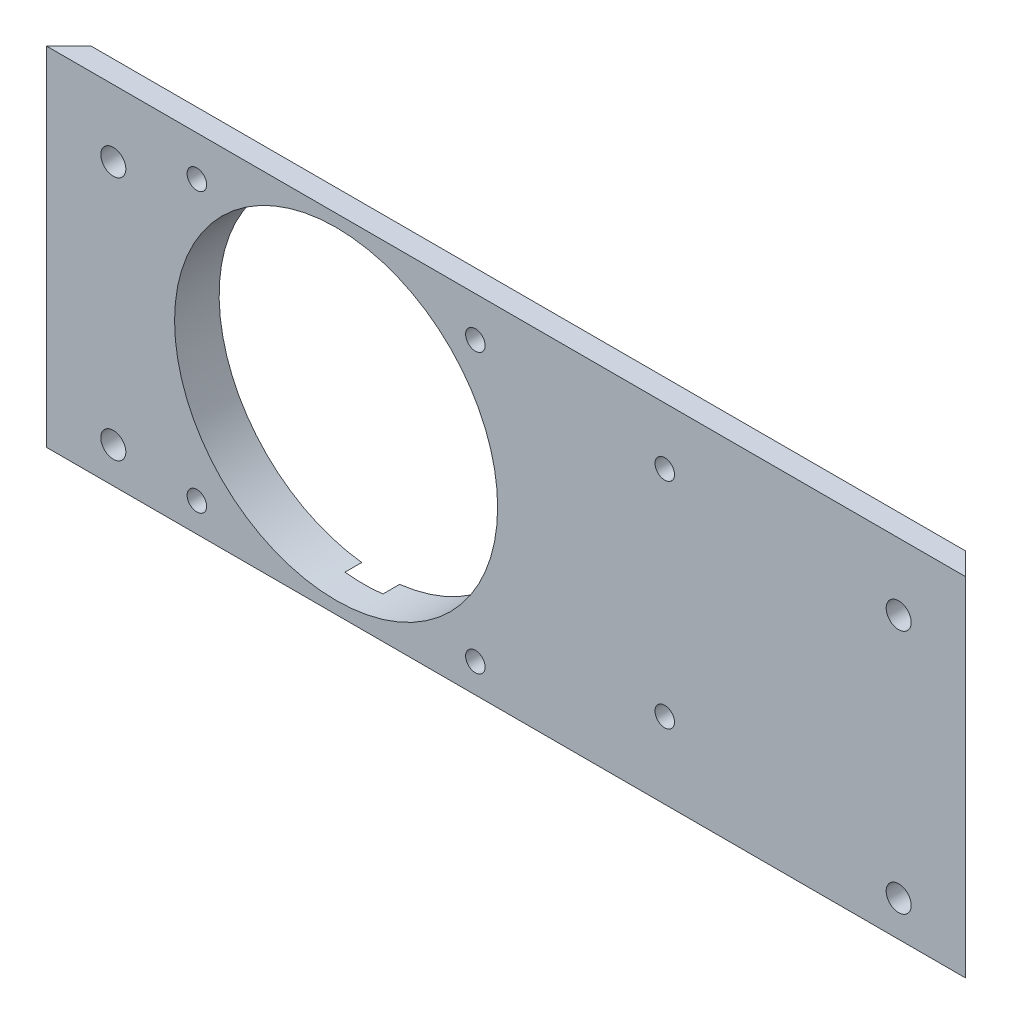
ISO-10303-21;
HEADER;
FILE_DESCRIPTION(('STEP AP214'),'2;1');
FILE_NAME('part.step','',(''),(''),'','','');
FILE_SCHEMA(('AUTOMOTIVE_DESIGN { 1 0 10303 214 1 1 1 1 }'));
ENDSEC;
DATA;
#1=APPLICATION_CONTEXT('core data for automotive mechanical design processes');
#2=APPLICATION_PROTOCOL_DEFINITION('international standard','automotive_design',2000,#1);
#3=PRODUCT_CONTEXT('',#1,'mechanical');
#4=PRODUCT('Part','Part','',(#3));
#5=PRODUCT_RELATED_PRODUCT_CATEGORY('part','',(#4));
#6=PRODUCT_DEFINITION_FORMATION('','',#4);
#7=PRODUCT_DEFINITION_CONTEXT('part definition',#1,'design');
#8=PRODUCT_DEFINITION('design','',#6,#7);
#9=PRODUCT_DEFINITION_SHAPE('','',#8);
#10=(LENGTH_UNIT() NAMED_UNIT(*) SI_UNIT(.MILLI.,.METRE.));
#11=(NAMED_UNIT(*) PLANE_ANGLE_UNIT() SI_UNIT($,.RADIAN.));
#12=(NAMED_UNIT(*) SI_UNIT($,.STERADIAN.) SOLID_ANGLE_UNIT());
#13=UNCERTAINTY_MEASURE_WITH_UNIT(LENGTH_MEASURE(1.E-05),#10,'distance_accuracy_value','');
#14=(GEOMETRIC_REPRESENTATION_CONTEXT(3) GLOBAL_UNCERTAINTY_ASSIGNED_CONTEXT((#13)) GLOBAL_UNIT_ASSIGNED_CONTEXT((#10,
#11,#12)) REPRESENTATION_CONTEXT('',''));
#15=CARTESIAN_POINT('',(0.,0.,0.));
#16=DIRECTION('',(0.,0.,1.));
#17=DIRECTION('',(1.,0.,0.));
#18=AXIS2_PLACEMENT_3D('',#15,#16,#17);
#19=CARTESIAN_POINT('',(0.,0.,-8.));
#20=DIRECTION('',(0.,0.,1.));
#21=DIRECTION('',(1.,0.,0.));
#22=AXIS2_PLACEMENT_3D('',#19,#20,#21);
#23=PLANE('',#22);
#24=CARTESIAN_POINT('',(27.0000000000001,7.79999999999999,-8.));
#25=DIRECTION('',(0.,0.,1.));
#26=DIRECTION('',(1.,0.,0.));
#27=AXIS2_PLACEMENT_3D('',#24,#25,#26);
#28=CIRCLE('',#27,1.75);
#29=CARTESIAN_POINT('',(28.7500000000001,7.79999999999999,-8.));
#30=VERTEX_POINT('',#29);
#31=EDGE_CURVE('E275',#30,#30,#28,.T.);
#32=ORIENTED_EDGE('',*,*,#31,.T.);
#33=EDGE_LOOP('',(#32));
#34=FACE_BOUND('',#33,.T.);
#35=CARTESIAN_POINT('',(26.9999999999996,57.8,-8.));
#36=DIRECTION('',(0.,0.,1.));
#37=DIRECTION('',(1.,0.,0.));
#38=AXIS2_PLACEMENT_3D('',#35,#36,#37);
#39=CIRCLE('',#38,1.75);
#40=CARTESIAN_POINT('',(28.7499999999996,57.8,-8.));
#41=VERTEX_POINT('',#40);
#42=EDGE_CURVE('E258',#41,#41,#39,.T.);
#43=ORIENTED_EDGE('',*,*,#42,.T.);
#44=EDGE_LOOP('',(#43));
#45=FACE_BOUND('',#44,.T.);
#46=CARTESIAN_POINT('',(12.,9.,-8.));
#47=DIRECTION('',(0.,0.,-1.));
#48=DIRECTION('',(-1.,0.,0.));
#49=AXIS2_PLACEMENT_3D('',#46,#47,#48);
#50=CIRCLE('',#49,2.25);
#51=CARTESIAN_POINT('',(9.75,9.,-8.));
#52=VERTEX_POINT('',#51);
#53=EDGE_CURVE('E239',#52,#52,#50,.T.);
#54=ORIENTED_EDGE('',*,*,#53,.F.);
#55=EDGE_LOOP('',(#54));
#56=FACE_BOUND('',#55,.T.);
#57=CARTESIAN_POINT('',(12.,53.,-8.));
#58=DIRECTION('',(0.,0.,-1.));
#59=DIRECTION('',(-1.,0.,0.));
#60=AXIS2_PLACEMENT_3D('',#57,#58,#59);
#61=CIRCLE('',#60,2.25000000000001);
#62=CARTESIAN_POINT('',(9.74999999999996,53.,-8.));
#63=VERTEX_POINT('',#62);
#64=EDGE_CURVE('E214',#63,#63,#61,.T.);
#65=ORIENTED_EDGE('',*,*,#64,.F.);
#66=EDGE_LOOP('',(#65));
#67=FACE_BOUND('',#66,.T.);
#68=DIRECTION('',(1.,0.,0.));
#69=VECTOR('',#68,1.);
#70=CARTESIAN_POINT('',(157.,61.,-8.));
#71=LINE('',#70,#69);
#72=CARTESIAN_POINT('',(8.00000000000001,61.,-8.));
#73=VERTEX_POINT('',#72);
#74=CARTESIAN_POINT('',(41.9421672314555,61.,-8.));
#75=VERTEX_POINT('',#74);
#76=EDGE_CURVE('E133',#73,#75,#71,.T.);
#77=ORIENTED_EDGE('',*,*,#76,.T.);
#78=CARTESIAN_POINT('',(51.9999999999996,33.8,-8.));
#79=DIRECTION('',(0.,0.,1.));
#80=DIRECTION('',(1.,0.,0.));
#81=AXIS2_PLACEMENT_3D('',#78,#79,#80);
#82=CIRCLE('',#81,29.);
#83=CARTESIAN_POINT('',(48.5999999999997,4.99999999999999,-8.));
#84=VERTEX_POINT('',#83);
#85=EDGE_CURVE('E53',#75,#84,#82,.T.);
#86=ORIENTED_EDGE('',*,*,#85,.T.);
#87=DIRECTION('',(-1.,0.,0.));
#88=VECTOR('',#87,1.);
#89=CARTESIAN_POINT('',(0.,5.,-8.));
#90=LINE('',#89,#88);
#91=CARTESIAN_POINT('',(8.00000000000001,5.,-8.));
#92=VERTEX_POINT('',#91);
#93=EDGE_CURVE('E205',#84,#92,#90,.T.);
#94=ORIENTED_EDGE('',*,*,#93,.T.);
#95=DIRECTION('',(0.,1.,0.));
#96=VECTOR('',#95,1.);
#97=CARTESIAN_POINT('',(8.00000000000001,65.,-8.));
#98=LINE('',#97,#96);
#99=EDGE_CURVE('E188',#92,#73,#98,.T.);
#100=ORIENTED_EDGE('',*,*,#99,.T.);
#101=EDGE_LOOP('',(#77,#86,#94,#100));
#102=FACE_BOUND('',#101,.T.);
#103=ADVANCED_FACE('F38',(#34,#45,#56,#67,#102),#23,.F.);
#104=CARTESIAN_POINT('',(0.,5.,-8.));
#105=DIRECTION('',(0.,1.,0.));
#106=DIRECTION('',(-1.,0.,0.));
#107=AXIS2_PLACEMENT_3D('',#104,#105,#106);
#108=PLANE('',#107);
#109=ORIENTED_EDGE('',*,*,#93,.F.);
#110=DIRECTION('',(0.,0.,1.));
#111=VECTOR('',#110,1.);
#112=CARTESIAN_POINT('',(48.5999999999997,4.99999999999999,-8.));
#113=LINE('',#112,#111);
#114=CARTESIAN_POINT('',(48.5999999999997,4.99999999999999,-5.));
#115=VERTEX_POINT('',#114);
#116=EDGE_CURVE('E251',#84,#115,#113,.T.);
#117=ORIENTED_EDGE('',*,*,#116,.T.);
#118=DIRECTION('',(-1.,0.,0.));
#119=VECTOR('',#118,1.);
#120=CARTESIAN_POINT('',(0.,5.,-5.));
#121=LINE('',#120,#119);
#122=CARTESIAN_POINT('',(5.00000000000001,5.,-5.));
#123=VERTEX_POINT('',#122);
#124=EDGE_CURVE('E206',#115,#123,#121,.T.);
#125=ORIENTED_EDGE('',*,*,#124,.T.);
#126=DIRECTION('',(0.707106781186548,0.,-0.707106781186548));
#127=VECTOR('',#126,1.);
#128=CARTESIAN_POINT('',(8.00000000000001,5.,-8.));
#129=LINE('',#128,#127);
#130=EDGE_CURVE('E169',#123,#92,#129,.T.);
#131=ORIENTED_EDGE('',*,*,#130,.T.);
#132=EDGE_LOOP('',(#109,#117,#125,#131));
#133=FACE_BOUND('',#132,.T.);
#134=ADVANCED_FACE('F203',(#133),#108,.F.);
#135=CARTESIAN_POINT('',(0.,65.,-5.));
#136=DIRECTION('',(0.,1.,0.));
#137=DIRECTION('',(0.,0.,1.));
#138=AXIS2_PLACEMENT_3D('',#135,#136,#137);
#139=PLANE('',#138);
#140=DIRECTION('',(-0.707106781186548,0.,-0.707106781186548));
#141=VECTOR('',#140,1.);
#142=CARTESIAN_POINT('',(80.,65.,-85.));
#143=LINE('',#142,#141);
#144=CARTESIAN_POINT('',(165.,65.,0.));
#145=VERTEX_POINT('',#144);
#146=CARTESIAN_POINT('',(161.,65.,-3.99999999999999));
#147=VERTEX_POINT('',#146);
#148=EDGE_CURVE('E134',#145,#147,#143,.T.);
#149=ORIENTED_EDGE('',*,*,#148,.T.);
#150=DIRECTION('',(-1.,0.,0.));
#151=VECTOR('',#150,1.);
#152=CARTESIAN_POINT('',(8.00000000000001,65.,-4.));
#153=LINE('',#152,#151);
#154=CARTESIAN_POINT('',(4.,65.,-4.));
#155=VERTEX_POINT('',#154);
#156=EDGE_CURVE('E142',#147,#155,#153,.T.);
#157=ORIENTED_EDGE('',*,*,#156,.T.);
#158=DIRECTION('',(-0.707106781186548,0.,0.707106781186548));
#159=VECTOR('',#158,1.);
#160=CARTESIAN_POINT('',(2.5,65.,-2.5));
#161=LINE('',#160,#159);
#162=CARTESIAN_POINT('',(0.,65.,0.));
#163=VERTEX_POINT('',#162);
#164=EDGE_CURVE('E137',#155,#163,#161,.T.);
#165=ORIENTED_EDGE('',*,*,#164,.T.);
#166=DIRECTION('',(-1.,0.,0.));
#167=VECTOR('',#166,1.);
#168=CARTESIAN_POINT('',(0.,65.,0.));
#169=LINE('',#168,#167);
#170=EDGE_CURVE('E180',#145,#163,#169,.T.);
#171=ORIENTED_EDGE('',*,*,#170,.F.);
#172=EDGE_LOOP('',(#149,#157,#165,#171));
#173=FACE_BOUND('',#172,.T.);
#174=ADVANCED_FACE('F179',(#173),#139,.T.);
#175=CARTESIAN_POINT('',(0.,0.,-5.));
#176=DIRECTION('',(0.,0.,-1.));
#177=DIRECTION('',(-1.,0.,0.));
#178=AXIS2_PLACEMENT_3D('',#175,#176,#177);
#179=PLANE('',#178);
#180=CARTESIAN_POINT('',(51.9999999999996,33.8,-5.));
#181=DIRECTION('',(0.,0.,-1.));
#182=DIRECTION('',(-1.,0.,0.));
#183=AXIS2_PLACEMENT_3D('',#180,#181,#182);
#184=CIRCLE('',#183,29.);
#185=CARTESIAN_POINT('',(55.3999999999995,4.99999999999999,-5.));
#186=VERTEX_POINT('',#185);
#187=EDGE_CURVE('E253',#186,#115,#184,.T.);
#188=ORIENTED_EDGE('',*,*,#187,.F.);
#189=CARTESIAN_POINT('',(160.,4.99999999999997,-5.));
#190=VERTEX_POINT('',#189);
#191=EDGE_CURVE('E208',#190,#186,#121,.T.);
#192=ORIENTED_EDGE('',*,*,#191,.F.);
#193=DIRECTION('',(0.,-1.,0.));
#194=VECTOR('',#193,1.);
#195=CARTESIAN_POINT('',(160.,0.,-5.));
#196=LINE('',#195,#194);
#197=CARTESIAN_POINT('',(160.,2.59999999999997,-4.99999999999989));
#198=VERTEX_POINT('',#197);
#199=EDGE_CURVE('E163',#190,#198,#196,.T.);
#200=ORIENTED_EDGE('',*,*,#199,.T.);
#201=DIRECTION('',(1.,0.,0.));
#202=VECTOR('',#201,1.);
#203=CARTESIAN_POINT('',(-4.99999999999998,2.59999999999997,-4.99999999999989));
#204=LINE('',#203,#202);
#205=CARTESIAN_POINT('',(4.9999999999999,2.59999999999997,-4.99999999999989));
#206=VERTEX_POINT('',#205);
#207=EDGE_CURVE('E147',#206,#198,#204,.T.);
#208=ORIENTED_EDGE('',*,*,#207,.F.);
#209=DIRECTION('',(0.,1.,0.));
#210=VECTOR('',#209,1.);
#211=CARTESIAN_POINT('',(5.00000000000001,0.,-5.));
#212=LINE('',#211,#210);
#213=EDGE_CURVE('E159',#206,#123,#212,.T.);
#214=ORIENTED_EDGE('',*,*,#213,.T.);
#215=ORIENTED_EDGE('',*,*,#124,.F.);
#216=EDGE_LOOP('',(#188,#192,#200,#208,#214,#215));
#217=FACE_BOUND('',#216,.T.);
#218=ADVANCED_FACE('F157',(#217),#179,.T.);
#219=CARTESIAN_POINT('',(0.,0.,0.));
#220=DIRECTION('',(0.,0.,-1.));
#221=DIRECTION('',(-1.,0.,0.));
#222=AXIS2_PLACEMENT_3D('',#219,#220,#221);
#223=PLANE('',#222);
#224=CARTESIAN_POINT('',(111.,16.25,0.));
#225=DIRECTION('',(0.,0.,1.));
#226=DIRECTION('',(1.,0.,0.));
#227=AXIS2_PLACEMENT_3D('',#224,#225,#226);
#228=CIRCLE('',#227,1.75000000000001);
#229=CARTESIAN_POINT('',(112.75,16.25,0.));
#230=VERTEX_POINT('',#229);
#231=EDGE_CURVE('E260',#230,#230,#228,.T.);
#232=ORIENTED_EDGE('',*,*,#231,.F.);
#233=EDGE_LOOP('',(#232));
#234=FACE_BOUND('',#233,.T.);
#235=CARTESIAN_POINT('',(111.,54.75,0.));
#236=DIRECTION('',(0.,0.,1.));
#237=DIRECTION('',(1.,0.,0.));
#238=AXIS2_PLACEMENT_3D('',#235,#236,#237);
#239=CIRCLE('',#238,1.75);
#240=CARTESIAN_POINT('',(112.75,54.75,0.));
#241=VERTEX_POINT('',#240);
#242=EDGE_CURVE('E266',#241,#241,#239,.T.);
#243=ORIENTED_EDGE('',*,*,#242,.F.);
#244=EDGE_LOOP('',(#243));
#245=FACE_BOUND('',#244,.T.);
#246=CARTESIAN_POINT('',(27.0000000000001,7.79999999999999,0.));
#247=DIRECTION('',(0.,0.,1.));
#248=DIRECTION('',(1.,0.,0.));
#249=AXIS2_PLACEMENT_3D('',#246,#247,#248);
#250=CIRCLE('',#249,1.75);
#251=CARTESIAN_POINT('',(28.7500000000001,7.79999999999999,0.));
#252=VERTEX_POINT('',#251);
#253=EDGE_CURVE('E272',#252,#252,#250,.T.);
#254=ORIENTED_EDGE('',*,*,#253,.F.);
#255=EDGE_LOOP('',(#254));
#256=FACE_BOUND('',#255,.T.);
#257=CARTESIAN_POINT('',(77.0000000000001,7.79999999999999,0.));
#258=DIRECTION('',(0.,0.,1.));
#259=DIRECTION('',(1.,0.,0.));
#260=AXIS2_PLACEMENT_3D('',#257,#258,#259);
#261=CIRCLE('',#260,1.75);
#262=CARTESIAN_POINT('',(78.7500000000001,7.79999999999999,0.));
#263=VERTEX_POINT('',#262);
#264=EDGE_CURVE('E278',#263,#263,#261,.T.);
#265=ORIENTED_EDGE('',*,*,#264,.F.);
#266=EDGE_LOOP('',(#265));
#267=FACE_BOUND('',#266,.T.);
#268=CARTESIAN_POINT('',(76.9999999999996,57.8,0.));
#269=DIRECTION('',(0.,0.,1.));
#270=DIRECTION('',(1.,0.,0.));
#271=AXIS2_PLACEMENT_3D('',#268,#269,#270);
#272=CIRCLE('',#271,1.75);
#273=CARTESIAN_POINT('',(78.7499999999996,57.8,0.));
#274=VERTEX_POINT('',#273);
#275=EDGE_CURVE('E284',#274,#274,#272,.T.);
#276=ORIENTED_EDGE('',*,*,#275,.F.);
#277=EDGE_LOOP('',(#276));
#278=FACE_BOUND('',#277,.T.);
#279=CARTESIAN_POINT('',(26.9999999999996,57.8,0.));
#280=DIRECTION('',(0.,0.,1.));
#281=DIRECTION('',(1.,0.,0.));
#282=AXIS2_PLACEMENT_3D('',#279,#280,#281);
#283=CIRCLE('',#282,1.75);
#284=CARTESIAN_POINT('',(28.7499999999996,57.8,0.));
#285=VERTEX_POINT('',#284);
#286=EDGE_CURVE('E290',#285,#285,#283,.T.);
#287=ORIENTED_EDGE('',*,*,#286,.F.);
#288=EDGE_LOOP('',(#287));
#289=FACE_BOUND('',#288,.T.);
#290=CARTESIAN_POINT('',(51.9999999999996,33.8,0.));
#291=DIRECTION('',(0.,0.,1.));
#292=DIRECTION('',(1.,0.,0.));
#293=AXIS2_PLACEMENT_3D('',#290,#291,#292);
#294=CIRCLE('',#293,29.);
#295=CARTESIAN_POINT('',(80.9999999999996,33.8,0.));
#296=VERTEX_POINT('',#295);
#297=EDGE_CURVE('E128',#296,#296,#294,.T.);
#298=ORIENTED_EDGE('',*,*,#297,.F.);
#299=EDGE_LOOP('',(#298));
#300=FACE_BOUND('',#299,.T.);
#301=CARTESIAN_POINT('',(153.,53.,0.));
#302=DIRECTION('',(0.,0.,1.));
#303=DIRECTION('',(-1.,0.,0.));
#304=AXIS2_PLACEMENT_3D('',#301,#302,#303);
#305=CIRCLE('',#304,2.25000000000004);
#306=CARTESIAN_POINT('',(150.75,53.,0.));
#307=VERTEX_POINT('',#306);
#308=EDGE_CURVE('E210',#307,#307,#305,.T.);
#309=ORIENTED_EDGE('',*,*,#308,.F.);
#310=EDGE_LOOP('',(#309));
#311=FACE_BOUND('',#310,.T.);
#312=CARTESIAN_POINT('',(12.,53.,0.));
#313=DIRECTION('',(0.,0.,1.));
#314=DIRECTION('',(1.,0.,0.));
#315=AXIS2_PLACEMENT_3D('',#312,#313,#314);
#316=CIRCLE('',#315,2.25);
#317=CARTESIAN_POINT('',(14.25,53.,0.));
#318=VERTEX_POINT('',#317);
#319=EDGE_CURVE('E219',#318,#318,#316,.T.);
#320=ORIENTED_EDGE('',*,*,#319,.F.);
#321=EDGE_LOOP('',(#320));
#322=FACE_BOUND('',#321,.T.);
#323=CARTESIAN_POINT('',(153.,9.,0.));
#324=DIRECTION('',(0.,0.,1.));
#325=DIRECTION('',(-1.,0.,0.));
#326=AXIS2_PLACEMENT_3D('',#323,#324,#325);
#327=CIRCLE('',#326,2.25000000000004);
#328=CARTESIAN_POINT('',(150.75,9.,0.));
#329=VERTEX_POINT('',#328);
#330=EDGE_CURVE('E194',#329,#329,#327,.T.);
#331=ORIENTED_EDGE('',*,*,#330,.F.);
#332=EDGE_LOOP('',(#331));
#333=FACE_BOUND('',#332,.T.);
#334=CARTESIAN_POINT('',(12.,9.,0.));
#335=DIRECTION('',(0.,0.,1.));
#336=DIRECTION('',(1.,0.,0.));
#337=AXIS2_PLACEMENT_3D('',#334,#335,#336);
#338=CIRCLE('',#337,2.25);
#339=CARTESIAN_POINT('',(14.25,9.,0.));
#340=VERTEX_POINT('',#339);
#341=EDGE_CURVE('E190',#340,#340,#338,.T.);
#342=ORIENTED_EDGE('',*,*,#341,.F.);
#343=EDGE_LOOP('',(#342));
#344=FACE_BOUND('',#343,.T.);
#345=DIRECTION('',(0.,-1.,0.));
#346=VECTOR('',#345,1.);
#347=CARTESIAN_POINT('',(0.,0.,0.));
#348=LINE('',#347,#346);
#349=CARTESIAN_POINT('',(0.,2.59999999999997,0.));
#350=VERTEX_POINT('',#349);
#351=EDGE_CURVE('E185',#163,#350,#348,.T.);
#352=ORIENTED_EDGE('',*,*,#351,.T.);
#353=DIRECTION('',(1.,0.,0.));
#354=VECTOR('',#353,1.);
#355=CARTESIAN_POINT('',(0.,2.59999999999997,1.2490009027033E-13));
#356=LINE('',#355,#354);
#357=CARTESIAN_POINT('',(165.,2.59999999999997,1.2490009027033E-13));
#358=VERTEX_POINT('',#357);
#359=EDGE_CURVE('E61',#350,#358,#356,.T.);
#360=ORIENTED_EDGE('',*,*,#359,.T.);
#361=DIRECTION('',(0.,1.,0.));
#362=VECTOR('',#361,1.);
#363=CARTESIAN_POINT('',(165.,0.,0.));
#364=LINE('',#363,#362);
#365=EDGE_CURVE('E187',#358,#145,#364,.T.);
#366=ORIENTED_EDGE('',*,*,#365,.T.);
#367=ORIENTED_EDGE('',*,*,#170,.T.);
#368=EDGE_LOOP('',(#352,#360,#366,#367));
#369=FACE_BOUND('',#368,.T.);
#370=ADVANCED_FACE('F184',(#234,#245,#256,#267,#278,#289,#300,#311,#322,#333,#344,#369),#223,.F.);
#371=CARTESIAN_POINT('',(12.,9.,-5.));
#372=DIRECTION('',(0.,0.,1.));
#373=DIRECTION('',(1.,0.,0.));
#374=AXIS2_PLACEMENT_3D('',#371,#372,#373);
#375=CYLINDRICAL_SURFACE('',#374,2.25);
#376=ORIENTED_EDGE('',*,*,#341,.T.);
#377=EDGE_LOOP('',(#376));
#378=FACE_BOUND('',#377,.T.);
#379=ORIENTED_EDGE('',*,*,#53,.T.);
#380=EDGE_LOOP('',(#379));
#381=FACE_BOUND('',#380,.T.);
#382=ADVANCED_FACE('F229',(#378,#381),#375,.F.);
#383=CARTESIAN_POINT('',(153.,9.,-5.));
#384=DIRECTION('',(0.,0.,1.));
#385=DIRECTION('',(1.,0.,0.));
#386=AXIS2_PLACEMENT_3D('',#383,#384,#385);
#387=CYLINDRICAL_SURFACE('',#386,2.25000000000004);
#388=ORIENTED_EDGE('',*,*,#330,.T.);
#389=EDGE_LOOP('',(#388));
#390=FACE_BOUND('',#389,.T.);
#391=CARTESIAN_POINT('',(153.,9.,-8.));
#392=DIRECTION('',(0.,0.,-1.));
#393=DIRECTION('',(-1.,0.,0.));
#394=AXIS2_PLACEMENT_3D('',#391,#392,#393);
#395=CIRCLE('',#394,2.25000000000004);
#396=CARTESIAN_POINT('',(150.75,9.,-8.));
#397=VERTEX_POINT('',#396);
#398=EDGE_CURVE('E241',#397,#397,#395,.T.);
#399=ORIENTED_EDGE('',*,*,#398,.T.);
#400=EDGE_LOOP('',(#399));
#401=FACE_BOUND('',#400,.T.);
#402=ADVANCED_FACE('F224',(#390,#401),#387,.F.);
#403=CARTESIAN_POINT('',(12.,53.,-5.));
#404=DIRECTION('',(0.,0.,1.));
#405=DIRECTION('',(1.,0.,0.));
#406=AXIS2_PLACEMENT_3D('',#403,#404,#405);
#407=CYLINDRICAL_SURFACE('',#406,2.25);
#408=ORIENTED_EDGE('',*,*,#319,.T.);
#409=EDGE_LOOP('',(#408));
#410=FACE_BOUND('',#409,.T.);
#411=ORIENTED_EDGE('',*,*,#64,.T.);
#412=EDGE_LOOP('',(#411));
#413=FACE_BOUND('',#412,.T.);
#414=ADVANCED_FACE('F311',(#410,#413),#407,.F.);
#415=CARTESIAN_POINT('',(153.,53.,-5.));
#416=DIRECTION('',(0.,0.,1.));
#417=DIRECTION('',(1.,0.,0.));
#418=AXIS2_PLACEMENT_3D('',#415,#416,#417);
#419=CYLINDRICAL_SURFACE('',#418,2.25000000000004);
#420=ORIENTED_EDGE('',*,*,#308,.T.);
#421=EDGE_LOOP('',(#420));
#422=FACE_BOUND('',#421,.T.);
#423=CARTESIAN_POINT('',(153.,53.,-8.));
#424=DIRECTION('',(0.,0.,-1.));
#425=DIRECTION('',(-1.,0.,0.));
#426=AXIS2_PLACEMENT_3D('',#423,#424,#425);
#427=CIRCLE('',#426,2.25000000000004);
#428=CARTESIAN_POINT('',(150.75,53.,-8.));
#429=VERTEX_POINT('',#428);
#430=EDGE_CURVE('E244',#429,#429,#427,.T.);
#431=ORIENTED_EDGE('',*,*,#430,.T.);
#432=EDGE_LOOP('',(#431));
#433=FACE_BOUND('',#432,.T.);
#434=ADVANCED_FACE('F314',(#422,#433),#419,.F.);
#435=CARTESIAN_POINT('',(111.,16.25,-8.));
#436=DIRECTION('',(0.,0.,1.));
#437=DIRECTION('',(1.,0.,0.));
#438=AXIS2_PLACEMENT_3D('',#435,#436,#437);
#439=CIRCLE('',#438,1.75000000000001);
#440=CARTESIAN_POINT('',(112.75,16.25,-8.));
#441=VERTEX_POINT('',#440);
#442=EDGE_CURVE('E263',#441,#441,#439,.T.);
#443=ORIENTED_EDGE('',*,*,#442,.T.);
#444=EDGE_LOOP('',(#443));
#445=FACE_BOUND('',#444,.T.);
#446=CARTESIAN_POINT('',(111.,54.75,-8.));
#447=DIRECTION('',(0.,0.,1.));
#448=DIRECTION('',(1.,0.,0.));
#449=AXIS2_PLACEMENT_3D('',#446,#447,#448);
#450=CIRCLE('',#449,1.75);
#451=CARTESIAN_POINT('',(112.75,54.75,-8.));
#452=VERTEX_POINT('',#451);
#453=EDGE_CURVE('E269',#452,#452,#450,.T.);
#454=ORIENTED_EDGE('',*,*,#453,.T.);
#455=EDGE_LOOP('',(#454));
#456=FACE_BOUND('',#455,.T.);
#457=CARTESIAN_POINT('',(77.0000000000001,7.79999999999999,-8.));
#458=DIRECTION('',(0.,0.,1.));
#459=DIRECTION('',(1.,0.,0.));
#460=AXIS2_PLACEMENT_3D('',#457,#458,#459);
#461=CIRCLE('',#460,1.75);
#462=CARTESIAN_POINT('',(78.7500000000001,7.79999999999999,-8.));
#463=VERTEX_POINT('',#462);
#464=EDGE_CURVE('E281',#463,#463,#461,.T.);
#465=ORIENTED_EDGE('',*,*,#464,.T.);
#466=EDGE_LOOP('',(#465));
#467=FACE_BOUND('',#466,.T.);
#468=CARTESIAN_POINT('',(76.9999999999996,57.8,-8.));
#469=DIRECTION('',(0.,0.,1.));
#470=DIRECTION('',(1.,0.,0.));
#471=AXIS2_PLACEMENT_3D('',#468,#469,#470);
#472=CIRCLE('',#471,1.75);
#473=CARTESIAN_POINT('',(78.7499999999996,57.8,-8.));
#474=VERTEX_POINT('',#473);
#475=EDGE_CURVE('E287',#474,#474,#472,.T.);
#476=ORIENTED_EDGE('',*,*,#475,.T.);
#477=EDGE_LOOP('',(#476));
#478=FACE_BOUND('',#477,.T.);
#479=CARTESIAN_POINT('',(157.,4.99999999999997,-8.));
#480=VERTEX_POINT('',#479);
#481=CARTESIAN_POINT('',(55.3999999999995,4.99999999999999,-8.));
#482=VERTEX_POINT('',#481);
#483=EDGE_CURVE('E127',#480,#482,#90,.T.);
#484=ORIENTED_EDGE('',*,*,#483,.T.);
#485=CARTESIAN_POINT('',(62.0578327685437,61.,-8.));
#486=VERTEX_POINT('',#485);
#487=EDGE_CURVE('E114',#482,#486,#82,.T.);
#488=ORIENTED_EDGE('',*,*,#487,.T.);
#489=CARTESIAN_POINT('',(157.,61.,-8.));
#490=VERTEX_POINT('',#489);
#491=EDGE_CURVE('E124',#486,#490,#71,.T.);
#492=ORIENTED_EDGE('',*,*,#491,.T.);
#493=DIRECTION('',(0.,-1.,0.));
#494=VECTOR('',#493,1.);
#495=CARTESIAN_POINT('',(157.,4.99999999999997,-8.));
#496=LINE('',#495,#494);
#497=EDGE_CURVE('E200',#490,#480,#496,.T.);
#498=ORIENTED_EDGE('',*,*,#497,.T.);
#499=EDGE_LOOP('',(#484,#488,#492,#498));
#500=FACE_BOUND('',#499,.T.);
#501=ORIENTED_EDGE('',*,*,#398,.F.);
#502=EDGE_LOOP('',(#501));
#503=FACE_BOUND('',#502,.T.);
#504=ORIENTED_EDGE('',*,*,#430,.F.);
#505=EDGE_LOOP('',(#504));
#506=FACE_BOUND('',#505,.T.);
#507=ADVANCED_FACE('F122',(#445,#456,#467,#478,#500,#503,#506),#23,.F.);
#508=ORIENTED_EDGE('',*,*,#191,.T.);
#509=DIRECTION('',(0.,0.,1.));
#510=VECTOR('',#509,1.);
#511=CARTESIAN_POINT('',(55.3999999999995,4.99999999999999,-8.));
#512=LINE('',#511,#510);
#513=EDGE_CURVE('E255',#186,#482,#512,.F.);
#514=ORIENTED_EDGE('',*,*,#513,.T.);
#515=ORIENTED_EDGE('',*,*,#483,.F.);
#516=DIRECTION('',(0.707106781186548,0.,0.707106781186548));
#517=VECTOR('',#516,1.);
#518=CARTESIAN_POINT('',(157.,4.99999999999997,-8.));
#519=LINE('',#518,#517);
#520=EDGE_CURVE('E170',#480,#190,#519,.T.);
#521=ORIENTED_EDGE('',*,*,#520,.T.);
#522=EDGE_LOOP('',(#508,#514,#515,#521));
#523=FACE_BOUND('',#522,.T.);
#524=ADVANCED_FACE('F325',(#523),#108,.F.);
#525=CARTESIAN_POINT('',(157.,0.,-8.));
#526=DIRECTION('',(0.707106781186548,0.,-0.707106781186548));
#527=DIRECTION('',(0.,1.,0.));
#528=AXIS2_PLACEMENT_3D('',#525,#526,#527);
#529=PLANE('',#528);
#530=DIRECTION('',(0.707106781186545,0.,0.70710678118655));
#531=VECTOR('',#530,1.);
#532=CARTESIAN_POINT('',(165.,2.59999999999997,1.2490009027033E-13));
#533=LINE('',#532,#531);
#534=EDGE_CURVE('E164',#198,#358,#533,.T.);
#535=ORIENTED_EDGE('',*,*,#534,.F.);
#536=ORIENTED_EDGE('',*,*,#199,.F.);
#537=ORIENTED_EDGE('',*,*,#520,.F.);
#538=ORIENTED_EDGE('',*,*,#497,.F.);
#539=DIRECTION('',(0.577350269189626,0.577350269189626,0.577350269189626));
#540=VECTOR('',#539,1.);
#541=CARTESIAN_POINT('',(136.666666666667,40.6666666666667,-28.3333333333333));
#542=LINE('',#541,#540);
#543=EDGE_CURVE('E131',#490,#147,#542,.T.);
#544=ORIENTED_EDGE('',*,*,#543,.T.);
#545=ORIENTED_EDGE('',*,*,#148,.F.);
#546=ORIENTED_EDGE('',*,*,#365,.F.);
#547=EDGE_LOOP('',(#535,#536,#537,#538,#544,#545,#546));
#548=FACE_BOUND('',#547,.T.);
#549=ADVANCED_FACE('F333',(#548),#529,.T.);
#550=CARTESIAN_POINT('',(8.00000000000001,0.,-8.));
#551=DIRECTION('',(-0.707106781186547,0.,-0.707106781186547));
#552=DIRECTION('',(0.,-1.,0.));
#553=AXIS2_PLACEMENT_3D('',#550,#551,#552);
#554=PLANE('',#553);
#555=DIRECTION('',(0.707106781186548,0.,-0.707106781186548));
#556=VECTOR('',#555,1.);
#557=CARTESIAN_POINT('',(8.00000000000001,2.59999999999997,-8.));
#558=LINE('',#557,#556);
#559=EDGE_CURVE('E47',#350,#206,#558,.T.);
#560=ORIENTED_EDGE('',*,*,#559,.F.);
#561=ORIENTED_EDGE('',*,*,#351,.F.);
#562=ORIENTED_EDGE('',*,*,#164,.F.);
#563=DIRECTION('',(0.577350269189626,-0.577350269189626,-0.577350269189626));
#564=VECTOR('',#563,1.);
#565=CARTESIAN_POINT('',(28.3333333333333,40.6666666666667,-28.3333333333333));
#566=LINE('',#565,#564);
#567=EDGE_CURVE('E144',#155,#73,#566,.T.);
#568=ORIENTED_EDGE('',*,*,#567,.T.);
#569=ORIENTED_EDGE('',*,*,#99,.F.);
#570=ORIENTED_EDGE('',*,*,#130,.F.);
#571=ORIENTED_EDGE('',*,*,#213,.F.);
#572=EDGE_LOOP('',(#560,#561,#562,#568,#569,#570,#571));
#573=FACE_BOUND('',#572,.T.);
#574=ADVANCED_FACE('F166',(#573),#554,.T.);
#575=CARTESIAN_POINT('',(0.,61.,-8.));
#576=DIRECTION('',(0.,0.707106781186547,-0.707106781186547));
#577=DIRECTION('',(-1.,0.,0.));
#578=AXIS2_PLACEMENT_3D('',#575,#576,#577);
#579=PLANE('',#578);
#580=CARTESIAN_POINT('',(51.9999999999996,33.8,-35.2));
#581=DIRECTION('',(0.,0.707106781186547,-0.707106781186547));
#582=DIRECTION('',(0.,0.707106781186548,0.707106781186548));
#583=AXIS2_PLACEMENT_3D('',#580,#581,#582);
#584=ELLIPSE('',#583,41.0121933088198,29.);
#585=EDGE_CURVE('E11',#75,#486,#584,.T.);
#586=ORIENTED_EDGE('',*,*,#585,.F.);
#587=ORIENTED_EDGE('',*,*,#76,.F.);
#588=ORIENTED_EDGE('',*,*,#567,.F.);
#589=ORIENTED_EDGE('',*,*,#156,.F.);
#590=ORIENTED_EDGE('',*,*,#543,.F.);
#591=ORIENTED_EDGE('',*,*,#491,.F.);
#592=EDGE_LOOP('',(#586,#587,#588,#589,#590,#591));
#593=FACE_BOUND('',#592,.T.);
#594=ADVANCED_FACE('F41',(#593),#579,.T.);
#595=CARTESIAN_POINT('',(0.,2.59999999999997,1.2490009027033E-13));
#596=DIRECTION('',(0.,1.,0.));
#597=DIRECTION('',(0.,0.,1.));
#598=AXIS2_PLACEMENT_3D('',#595,#596,#597);
#599=PLANE('',#598);
#600=ORIENTED_EDGE('',*,*,#559,.T.);
#601=ORIENTED_EDGE('',*,*,#207,.T.);
#602=ORIENTED_EDGE('',*,*,#534,.T.);
#603=ORIENTED_EDGE('',*,*,#359,.F.);
#604=EDGE_LOOP('',(#600,#601,#602,#603));
#605=FACE_BOUND('',#604,.T.);
#606=ADVANCED_FACE('F146',(#605),#599,.F.);
#607=CARTESIAN_POINT('',(51.9999999999996,33.8,-8.));
#608=DIRECTION('',(0.,0.,1.));
#609=DIRECTION('',(1.,0.,0.));
#610=AXIS2_PLACEMENT_3D('',#607,#608,#609);
#611=CYLINDRICAL_SURFACE('',#610,29.);
#612=ORIENTED_EDGE('',*,*,#297,.T.);
#613=EDGE_LOOP('',(#612));
#614=FACE_BOUND('',#613,.T.);
#615=ORIENTED_EDGE('',*,*,#85,.F.);
#616=ORIENTED_EDGE('',*,*,#585,.T.);
#617=ORIENTED_EDGE('',*,*,#487,.F.);
#618=ORIENTED_EDGE('',*,*,#513,.F.);
#619=ORIENTED_EDGE('',*,*,#187,.T.);
#620=ORIENTED_EDGE('',*,*,#116,.F.);
#621=EDGE_LOOP('',(#615,#616,#617,#618,#619,#620));
#622=FACE_BOUND('',#621,.T.);
#623=ADVANCED_FACE('F113',(#614,#622),#611,.F.);
#624=CARTESIAN_POINT('',(26.9999999999996,57.8,-8.));
#625=DIRECTION('',(0.,0.,1.));
#626=DIRECTION('',(1.,0.,0.));
#627=AXIS2_PLACEMENT_3D('',#624,#625,#626);
#628=CYLINDRICAL_SURFACE('',#627,1.75);
#629=ORIENTED_EDGE('',*,*,#42,.F.);
#630=EDGE_LOOP('',(#629));
#631=FACE_BOUND('',#630,.T.);
#632=ORIENTED_EDGE('',*,*,#286,.T.);
#633=EDGE_LOOP('',(#632));
#634=FACE_BOUND('',#633,.T.);
#635=ADVANCED_FACE('F297',(#631,#634),#628,.F.);
#636=CARTESIAN_POINT('',(76.9999999999996,57.8,-8.));
#637=DIRECTION('',(0.,0.,1.));
#638=DIRECTION('',(1.,0.,0.));
#639=AXIS2_PLACEMENT_3D('',#636,#637,#638);
#640=CYLINDRICAL_SURFACE('',#639,1.75);
#641=ORIENTED_EDGE('',*,*,#475,.F.);
#642=EDGE_LOOP('',(#641));
#643=FACE_BOUND('',#642,.T.);
#644=ORIENTED_EDGE('',*,*,#275,.T.);
#645=EDGE_LOOP('',(#644));
#646=FACE_BOUND('',#645,.T.);
#647=ADVANCED_FACE('F300',(#643,#646),#640,.F.);
#648=CARTESIAN_POINT('',(77.0000000000001,7.79999999999999,-8.));
#649=DIRECTION('',(0.,0.,1.));
#650=DIRECTION('',(1.,0.,0.));
#651=AXIS2_PLACEMENT_3D('',#648,#649,#650);
#652=CYLINDRICAL_SURFACE('',#651,1.75);
#653=ORIENTED_EDGE('',*,*,#464,.F.);
#654=EDGE_LOOP('',(#653));
#655=FACE_BOUND('',#654,.T.);
#656=ORIENTED_EDGE('',*,*,#264,.T.);
#657=EDGE_LOOP('',(#656));
#658=FACE_BOUND('',#657,.T.);
#659=ADVANCED_FACE('F347',(#655,#658),#652,.F.);
#660=CARTESIAN_POINT('',(27.0000000000001,7.79999999999999,-8.));
#661=DIRECTION('',(0.,0.,1.));
#662=DIRECTION('',(1.,0.,0.));
#663=AXIS2_PLACEMENT_3D('',#660,#661,#662);
#664=CYLINDRICAL_SURFACE('',#663,1.75);
#665=ORIENTED_EDGE('',*,*,#31,.F.);
#666=EDGE_LOOP('',(#665));
#667=FACE_BOUND('',#666,.T.);
#668=ORIENTED_EDGE('',*,*,#253,.T.);
#669=EDGE_LOOP('',(#668));
#670=FACE_BOUND('',#669,.T.);
#671=ADVANCED_FACE('F354',(#667,#670),#664,.F.);
#672=CARTESIAN_POINT('',(111.,54.75,-8.));
#673=DIRECTION('',(0.,0.,1.));
#674=DIRECTION('',(1.,0.,0.));
#675=AXIS2_PLACEMENT_3D('',#672,#673,#674);
#676=CYLINDRICAL_SURFACE('',#675,1.75);
#677=ORIENTED_EDGE('',*,*,#453,.F.);
#678=EDGE_LOOP('',(#677));
#679=FACE_BOUND('',#678,.T.);
#680=ORIENTED_EDGE('',*,*,#242,.T.);
#681=EDGE_LOOP('',(#680));
#682=FACE_BOUND('',#681,.T.);
#683=ADVANCED_FACE('F360',(#679,#682),#676,.F.);
#684=CARTESIAN_POINT('',(111.,16.25,-8.));
#685=DIRECTION('',(0.,0.,1.));
#686=DIRECTION('',(1.,0.,0.));
#687=AXIS2_PLACEMENT_3D('',#684,#685,#686);
#688=CYLINDRICAL_SURFACE('',#687,1.75000000000001);
#689=ORIENTED_EDGE('',*,*,#442,.F.);
#690=EDGE_LOOP('',(#689));
#691=FACE_BOUND('',#690,.T.);
#692=ORIENTED_EDGE('',*,*,#231,.T.);
#693=EDGE_LOOP('',(#692));
#694=FACE_BOUND('',#693,.T.);
#695=ADVANCED_FACE('F364',(#691,#694),#688,.F.);
#696=CLOSED_SHELL('',(#103,#134,#174,#218,#370,#382,#402,#414,#434,#507,#524,#549,#574,#594,
#606,#623,#635,#647,#659,#671,#683,#695));
#697=MANIFOLD_SOLID_BREP('B2',#696);
#698=ADVANCED_BREP_SHAPE_REPRESENTATION('',(#18,#697),#14);
#699=SHAPE_DEFINITION_REPRESENTATION(#9,#698);
ENDSEC;
END-ISO-10303-21;
